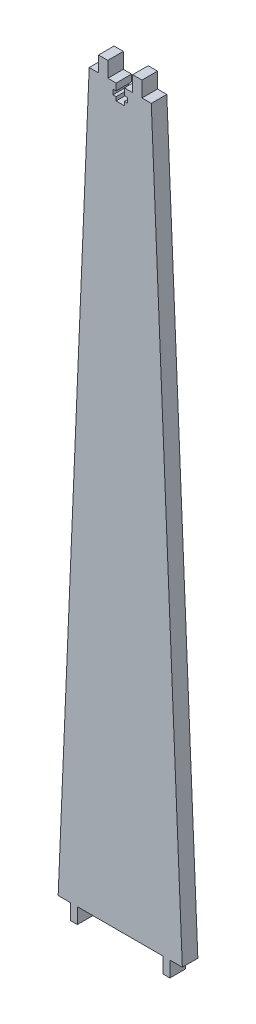
ISO-10303-21;
HEADER;
FILE_DESCRIPTION(('STEP AP214'),'2;1');
FILE_NAME('part.step','',(''),(''),'','','');
FILE_SCHEMA(('AUTOMOTIVE_DESIGN { 1 0 10303 214 1 1 1 1 }'));
ENDSEC;
DATA;
#1=APPLICATION_CONTEXT('core data for automotive mechanical design processes');
#2=APPLICATION_PROTOCOL_DEFINITION('international standard','automotive_design',2000,#1);
#3=PRODUCT_CONTEXT('',#1,'mechanical');
#4=PRODUCT('Part','Part','',(#3));
#5=PRODUCT_RELATED_PRODUCT_CATEGORY('part','',(#4));
#6=PRODUCT_DEFINITION_FORMATION('','',#4);
#7=PRODUCT_DEFINITION_CONTEXT('part definition',#1,'design');
#8=PRODUCT_DEFINITION('design','',#6,#7);
#9=PRODUCT_DEFINITION_SHAPE('','',#8);
#10=(LENGTH_UNIT() NAMED_UNIT(*) SI_UNIT(.MILLI.,.METRE.));
#11=(NAMED_UNIT(*) PLANE_ANGLE_UNIT() SI_UNIT($,.RADIAN.));
#12=(NAMED_UNIT(*) SI_UNIT($,.STERADIAN.) SOLID_ANGLE_UNIT());
#13=UNCERTAINTY_MEASURE_WITH_UNIT(LENGTH_MEASURE(1.E-05),#10,'distance_accuracy_value','');
#14=(GEOMETRIC_REPRESENTATION_CONTEXT(3) GLOBAL_UNCERTAINTY_ASSIGNED_CONTEXT((#13)) GLOBAL_UNIT_ASSIGNED_CONTEXT((#10,
#11,#12)) REPRESENTATION_CONTEXT('',''));
#15=CARTESIAN_POINT('',(0.,0.,0.));
#16=DIRECTION('',(0.,0.,1.));
#17=DIRECTION('',(1.,0.,0.));
#18=AXIS2_PLACEMENT_3D('',#15,#16,#17);
#19=CARTESIAN_POINT('',(-25.4,0.,6.35));
#20=DIRECTION('',(0.,1.,0.));
#21=DIRECTION('',(-1.,0.,0.));
#22=AXIS2_PLACEMENT_3D('',#19,#20,#21);
#23=PLANE('',#22);
#24=DIRECTION('',(1.,0.,0.));
#25=VECTOR('',#24,1.);
#26=CARTESIAN_POINT('',(-25.4,0.,0.));
#27=LINE('',#26,#25);
#28=CARTESIAN_POINT('',(-25.4,0.,0.));
#29=VERTEX_POINT('',#28);
#30=CARTESIAN_POINT('',(-20.3200000000001,0.,0.));
#31=VERTEX_POINT('',#30);
#32=EDGE_CURVE('E279',#29,#31,#27,.T.);
#33=ORIENTED_EDGE('',*,*,#32,.T.);
#34=DIRECTION('',(0.,0.,-1.));
#35=VECTOR('',#34,1.);
#36=CARTESIAN_POINT('',(-20.3200000000001,0.,6.35));
#37=LINE('',#36,#35);
#38=CARTESIAN_POINT('',(-20.3200000000001,0.,6.35));
#39=VERTEX_POINT('',#38);
#40=EDGE_CURVE('E11',#39,#31,#37,.T.);
#41=ORIENTED_EDGE('',*,*,#40,.F.);
#42=DIRECTION('',(1.,0.,0.));
#43=VECTOR('',#42,1.);
#44=CARTESIAN_POINT('',(-25.4,0.,6.35));
#45=LINE('',#44,#43);
#46=CARTESIAN_POINT('',(-25.4,0.,6.35));
#47=VERTEX_POINT('',#46);
#48=EDGE_CURVE('E341',#47,#39,#45,.T.);
#49=ORIENTED_EDGE('',*,*,#48,.F.);
#50=DIRECTION('',(0.,0.,-1.));
#51=VECTOR('',#50,1.);
#52=CARTESIAN_POINT('',(-25.4,0.,6.35));
#53=LINE('',#52,#51);
#54=EDGE_CURVE('E275',#47,#29,#53,.T.);
#55=ORIENTED_EDGE('',*,*,#54,.T.);
#56=EDGE_LOOP('',(#33,#41,#49,#55));
#57=FACE_BOUND('',#56,.T.);
#58=ADVANCED_FACE('F39',(#57),#23,.F.);
#59=CARTESIAN_POINT('',(-20.3200000000001,0.,6.35));
#60=DIRECTION('',(1.,0.,0.));
#61=DIRECTION('',(0.,1.,0.));
#62=AXIS2_PLACEMENT_3D('',#59,#60,#61);
#63=PLANE('',#62);
#64=DIRECTION('',(0.,-1.,0.));
#65=VECTOR('',#64,1.);
#66=CARTESIAN_POINT('',(-20.3200000000001,0.,0.));
#67=LINE('',#66,#65);
#68=CARTESIAN_POINT('',(-20.3200000000001,-6.35,0.));
#69=VERTEX_POINT('',#68);
#70=EDGE_CURVE('E282',#31,#69,#67,.T.);
#71=ORIENTED_EDGE('',*,*,#70,.T.);
#72=DIRECTION('',(0.,0.,-1.));
#73=VECTOR('',#72,1.);
#74=CARTESIAN_POINT('',(-20.3200000000001,-6.35,6.35));
#75=LINE('',#74,#73);
#76=CARTESIAN_POINT('',(-20.3200000000001,-6.35,6.35));
#77=VERTEX_POINT('',#76);
#78=EDGE_CURVE('E47',#77,#69,#75,.T.);
#79=ORIENTED_EDGE('',*,*,#78,.F.);
#80=DIRECTION('',(0.,-1.,0.));
#81=VECTOR('',#80,1.);
#82=CARTESIAN_POINT('',(-20.3200000000001,0.,6.35));
#83=LINE('',#82,#81);
#84=EDGE_CURVE('E170',#39,#77,#83,.T.);
#85=ORIENTED_EDGE('',*,*,#84,.F.);
#86=ORIENTED_EDGE('',*,*,#40,.T.);
#87=EDGE_LOOP('',(#71,#79,#85,#86));
#88=FACE_BOUND('',#87,.T.);
#89=ADVANCED_FACE('F519',(#88),#63,.F.);
#90=CARTESIAN_POINT('',(-20.3200000000001,-6.35,6.35));
#91=DIRECTION('',(0.,1.,0.));
#92=DIRECTION('',(0.,0.,1.));
#93=AXIS2_PLACEMENT_3D('',#90,#91,#92);
#94=PLANE('',#93);
#95=DIRECTION('',(1.,0.,0.));
#96=VECTOR('',#95,1.);
#97=CARTESIAN_POINT('',(-20.3200000000001,-6.35,0.));
#98=LINE('',#97,#96);
#99=CARTESIAN_POINT('',(-17.5260000000001,-6.35,0.));
#100=VERTEX_POINT('',#99);
#101=EDGE_CURVE('E284',#69,#100,#98,.T.);
#102=ORIENTED_EDGE('',*,*,#101,.T.);
#103=DIRECTION('',(0.,0.,-1.));
#104=VECTOR('',#103,1.);
#105=CARTESIAN_POINT('',(-17.5260000000001,-6.35,6.35));
#106=LINE('',#105,#104);
#107=CARTESIAN_POINT('',(-17.5260000000001,-6.35,6.35));
#108=VERTEX_POINT('',#107);
#109=EDGE_CURVE('E420',#108,#100,#106,.T.);
#110=ORIENTED_EDGE('',*,*,#109,.F.);
#111=DIRECTION('',(1.,0.,0.));
#112=VECTOR('',#111,1.);
#113=CARTESIAN_POINT('',(-20.3200000000001,-6.35,6.35));
#114=LINE('',#113,#112);
#115=EDGE_CURVE('E428',#77,#108,#114,.T.);
#116=ORIENTED_EDGE('',*,*,#115,.F.);
#117=ORIENTED_EDGE('',*,*,#78,.T.);
#118=EDGE_LOOP('',(#102,#110,#116,#117));
#119=FACE_BOUND('',#118,.T.);
#120=ADVANCED_FACE('F426',(#119),#94,.F.);
#121=CARTESIAN_POINT('',(-17.5260000000001,-6.35,6.35));
#122=DIRECTION('',(-1.,0.,0.));
#123=DIRECTION('',(0.,-1.,0.));
#124=AXIS2_PLACEMENT_3D('',#121,#122,#123);
#125=PLANE('',#124);
#126=DIRECTION('',(0.,1.,0.));
#127=VECTOR('',#126,1.);
#128=CARTESIAN_POINT('',(-17.5260000000001,-6.35,0.));
#129=LINE('',#128,#127);
#130=CARTESIAN_POINT('',(-17.526,0.,0.));
#131=VERTEX_POINT('',#130);
#132=EDGE_CURVE('E286',#100,#131,#129,.T.);
#133=ORIENTED_EDGE('',*,*,#132,.T.);
#134=DIRECTION('',(0.,0.,-1.));
#135=VECTOR('',#134,1.);
#136=CARTESIAN_POINT('',(-17.526,0.,6.35));
#137=LINE('',#136,#135);
#138=CARTESIAN_POINT('',(-17.526,0.,6.35));
#139=VERTEX_POINT('',#138);
#140=EDGE_CURVE('E417',#139,#131,#137,.T.);
#141=ORIENTED_EDGE('',*,*,#140,.F.);
#142=DIRECTION('',(0.,1.,0.));
#143=VECTOR('',#142,1.);
#144=CARTESIAN_POINT('',(-17.5260000000001,-6.35,6.35));
#145=LINE('',#144,#143);
#146=EDGE_CURVE('E446',#108,#139,#145,.T.);
#147=ORIENTED_EDGE('',*,*,#146,.F.);
#148=ORIENTED_EDGE('',*,*,#109,.T.);
#149=EDGE_LOOP('',(#133,#141,#147,#148));
#150=FACE_BOUND('',#149,.T.);
#151=ADVANCED_FACE('F437',(#150),#125,.F.);
#152=CARTESIAN_POINT('',(-17.526,0.,6.35));
#153=DIRECTION('',(0.,1.,0.));
#154=DIRECTION('',(0.,0.,1.));
#155=AXIS2_PLACEMENT_3D('',#152,#153,#154);
#156=PLANE('',#155);
#157=DIRECTION('',(1.,0.,0.));
#158=VECTOR('',#157,1.);
#159=CARTESIAN_POINT('',(-17.526,0.,0.));
#160=LINE('',#159,#158);
#161=CARTESIAN_POINT('',(17.526,0.,0.));
#162=VERTEX_POINT('',#161);
#163=EDGE_CURVE('E288',#131,#162,#160,.T.);
#164=ORIENTED_EDGE('',*,*,#163,.T.);
#165=DIRECTION('',(0.,0.,-1.));
#166=VECTOR('',#165,1.);
#167=CARTESIAN_POINT('',(17.526,0.,6.35));
#168=LINE('',#167,#166);
#169=CARTESIAN_POINT('',(17.526,0.,6.35));
#170=VERTEX_POINT('',#169);
#171=EDGE_CURVE('E414',#170,#162,#168,.T.);
#172=ORIENTED_EDGE('',*,*,#171,.F.);
#173=DIRECTION('',(1.,0.,0.));
#174=VECTOR('',#173,1.);
#175=CARTESIAN_POINT('',(-17.526,0.,6.35));
#176=LINE('',#175,#174);
#177=EDGE_CURVE('E443',#139,#170,#176,.T.);
#178=ORIENTED_EDGE('',*,*,#177,.F.);
#179=ORIENTED_EDGE('',*,*,#140,.T.);
#180=EDGE_LOOP('',(#164,#172,#178,#179));
#181=FACE_BOUND('',#180,.T.);
#182=ADVANCED_FACE('F441',(#181),#156,.F.);
#183=CARTESIAN_POINT('',(17.5260000000001,-6.35,6.35));
#184=DIRECTION('',(1.,0.,0.));
#185=DIRECTION('',(0.,1.,0.));
#186=AXIS2_PLACEMENT_3D('',#183,#184,#185);
#187=PLANE('',#186);
#188=DIRECTION('',(0.,-1.,0.));
#189=VECTOR('',#188,1.);
#190=CARTESIAN_POINT('',(17.5260000000001,-6.35,0.));
#191=LINE('',#190,#189);
#192=CARTESIAN_POINT('',(17.5260000000001,-6.35,0.));
#193=VERTEX_POINT('',#192);
#194=EDGE_CURVE('E290',#162,#193,#191,.T.);
#195=ORIENTED_EDGE('',*,*,#194,.T.);
#196=DIRECTION('',(0.,0.,-1.));
#197=VECTOR('',#196,1.);
#198=CARTESIAN_POINT('',(17.5260000000001,-6.35,6.35));
#199=LINE('',#198,#197);
#200=CARTESIAN_POINT('',(17.5260000000001,-6.35,6.35));
#201=VERTEX_POINT('',#200);
#202=EDGE_CURVE('E411',#201,#193,#199,.T.);
#203=ORIENTED_EDGE('',*,*,#202,.F.);
#204=DIRECTION('',(0.,-1.,0.));
#205=VECTOR('',#204,1.);
#206=CARTESIAN_POINT('',(17.5260000000001,-6.35,6.35));
#207=LINE('',#206,#205);
#208=EDGE_CURVE('E445',#170,#201,#207,.T.);
#209=ORIENTED_EDGE('',*,*,#208,.F.);
#210=ORIENTED_EDGE('',*,*,#171,.T.);
#211=EDGE_LOOP('',(#195,#203,#209,#210));
#212=FACE_BOUND('',#211,.T.);
#213=ADVANCED_FACE('F532',(#212),#187,.F.);
#214=CARTESIAN_POINT('',(20.3200000000001,-6.35,6.35));
#215=DIRECTION('',(0.,1.,0.));
#216=DIRECTION('',(0.,0.,1.));
#217=AXIS2_PLACEMENT_3D('',#214,#215,#216);
#218=PLANE('',#217);
#219=DIRECTION('',(1.,0.,0.));
#220=VECTOR('',#219,1.);
#221=CARTESIAN_POINT('',(20.3200000000001,-6.35,0.));
#222=LINE('',#221,#220);
#223=CARTESIAN_POINT('',(20.3200000000001,-6.35,0.));
#224=VERTEX_POINT('',#223);
#225=EDGE_CURVE('E292',#193,#224,#222,.T.);
#226=ORIENTED_EDGE('',*,*,#225,.T.);
#227=DIRECTION('',(0.,0.,-1.));
#228=VECTOR('',#227,1.);
#229=CARTESIAN_POINT('',(20.3200000000001,-6.35,6.35));
#230=LINE('',#229,#228);
#231=CARTESIAN_POINT('',(20.3200000000001,-6.35,6.35));
#232=VERTEX_POINT('',#231);
#233=EDGE_CURVE('E408',#232,#224,#230,.T.);
#234=ORIENTED_EDGE('',*,*,#233,.F.);
#235=DIRECTION('',(1.,0.,0.));
#236=VECTOR('',#235,1.);
#237=CARTESIAN_POINT('',(20.3200000000001,-6.35,6.35));
#238=LINE('',#237,#236);
#239=EDGE_CURVE('E448',#201,#232,#238,.T.);
#240=ORIENTED_EDGE('',*,*,#239,.F.);
#241=ORIENTED_EDGE('',*,*,#202,.T.);
#242=EDGE_LOOP('',(#226,#234,#240,#241));
#243=FACE_BOUND('',#242,.T.);
#244=ADVANCED_FACE('F535',(#243),#218,.F.);
#245=CARTESIAN_POINT('',(20.3200000000001,0.,6.35));
#246=DIRECTION('',(-1.,0.,0.));
#247=DIRECTION('',(0.,-1.,0.));
#248=AXIS2_PLACEMENT_3D('',#245,#246,#247);
#249=PLANE('',#248);
#250=DIRECTION('',(0.,1.,0.));
#251=VECTOR('',#250,1.);
#252=CARTESIAN_POINT('',(20.3200000000001,0.,0.));
#253=LINE('',#252,#251);
#254=CARTESIAN_POINT('',(20.3200000000001,0.,0.));
#255=VERTEX_POINT('',#254);
#256=EDGE_CURVE('E294',#224,#255,#253,.T.);
#257=ORIENTED_EDGE('',*,*,#256,.T.);
#258=DIRECTION('',(0.,0.,-1.));
#259=VECTOR('',#258,1.);
#260=CARTESIAN_POINT('',(20.3200000000001,0.,6.35));
#261=LINE('',#260,#259);
#262=CARTESIAN_POINT('',(20.3200000000001,0.,6.35));
#263=VERTEX_POINT('',#262);
#264=EDGE_CURVE('E405',#263,#255,#261,.T.);
#265=ORIENTED_EDGE('',*,*,#264,.F.);
#266=DIRECTION('',(0.,1.,0.));
#267=VECTOR('',#266,1.);
#268=CARTESIAN_POINT('',(20.3200000000001,0.,6.35));
#269=LINE('',#268,#267);
#270=EDGE_CURVE('E454',#232,#263,#269,.T.);
#271=ORIENTED_EDGE('',*,*,#270,.F.);
#272=ORIENTED_EDGE('',*,*,#233,.T.);
#273=EDGE_LOOP('',(#257,#265,#271,#272));
#274=FACE_BOUND('',#273,.T.);
#275=ADVANCED_FACE('F539',(#274),#249,.F.);
#276=CARTESIAN_POINT('',(25.4,0.,6.35));
#277=DIRECTION('',(0.,1.,0.));
#278=DIRECTION('',(-1.,0.,0.));
#279=AXIS2_PLACEMENT_3D('',#276,#277,#278);
#280=PLANE('',#279);
#281=DIRECTION('',(1.,0.,0.));
#282=VECTOR('',#281,1.);
#283=CARTESIAN_POINT('',(25.4,0.,0.));
#284=LINE('',#283,#282);
#285=CARTESIAN_POINT('',(25.4,0.,0.));
#286=VERTEX_POINT('',#285);
#287=EDGE_CURVE('E296',#255,#286,#284,.T.);
#288=ORIENTED_EDGE('',*,*,#287,.T.);
#289=DIRECTION('',(0.,0.,-1.));
#290=VECTOR('',#289,1.);
#291=CARTESIAN_POINT('',(25.4,0.,6.35));
#292=LINE('',#291,#290);
#293=CARTESIAN_POINT('',(25.4,0.,6.35));
#294=VERTEX_POINT('',#293);
#295=EDGE_CURVE('E402',#294,#286,#292,.T.);
#296=ORIENTED_EDGE('',*,*,#295,.F.);
#297=DIRECTION('',(1.,0.,0.));
#298=VECTOR('',#297,1.);
#299=CARTESIAN_POINT('',(25.4,0.,6.35));
#300=LINE('',#299,#298);
#301=EDGE_CURVE('E456',#263,#294,#300,.T.);
#302=ORIENTED_EDGE('',*,*,#301,.F.);
#303=ORIENTED_EDGE('',*,*,#264,.T.);
#304=EDGE_LOOP('',(#288,#296,#302,#303));
#305=FACE_BOUND('',#304,.T.);
#306=ADVANCED_FACE('F543',(#305),#280,.F.);
#307=CARTESIAN_POINT('',(25.4,0.,6.35));
#308=DIRECTION('',(-0.999103476537063,-0.0423348930736044,0.));
#309=DIRECTION('',(0.0423348930736044,-0.999103476537064,0.));
#310=AXIS2_PLACEMENT_3D('',#307,#308,#309);
#311=PLANE('',#310);
#312=DIRECTION('',(-0.0423348930736044,0.999103476537064,0.));
#313=VECTOR('',#312,1.);
#314=CARTESIAN_POINT('',(25.4,0.,0.));
#315=LINE('',#314,#313);
#316=CARTESIAN_POINT('',(12.7,299.72,0.));
#317=VERTEX_POINT('',#316);
#318=EDGE_CURVE('E298',#286,#317,#315,.T.);
#319=ORIENTED_EDGE('',*,*,#318,.T.);
#320=DIRECTION('',(0.,0.,-1.));
#321=VECTOR('',#320,1.);
#322=CARTESIAN_POINT('',(12.7,299.72,6.35));
#323=LINE('',#322,#321);
#324=CARTESIAN_POINT('',(12.7,299.72,6.35));
#325=VERTEX_POINT('',#324);
#326=EDGE_CURVE('E399',#325,#317,#323,.T.);
#327=ORIENTED_EDGE('',*,*,#326,.F.);
#328=DIRECTION('',(-0.0423348930736044,0.999103476537064,0.));
#329=VECTOR('',#328,1.);
#330=CARTESIAN_POINT('',(25.4,0.,6.35));
#331=LINE('',#330,#329);
#332=EDGE_CURVE('E458',#294,#325,#331,.T.);
#333=ORIENTED_EDGE('',*,*,#332,.F.);
#334=ORIENTED_EDGE('',*,*,#295,.T.);
#335=EDGE_LOOP('',(#319,#327,#333,#334));
#336=FACE_BOUND('',#335,.T.);
#337=ADVANCED_FACE('F547',(#336),#311,.F.);
#338=CARTESIAN_POINT('',(12.7,299.72,6.35));
#339=DIRECTION('',(0.,-1.,0.));
#340=DIRECTION('',(0.,0.,-1.));
#341=AXIS2_PLACEMENT_3D('',#338,#339,#340);
#342=PLANE('',#341);
#343=DIRECTION('',(-1.,0.,0.));
#344=VECTOR('',#343,1.);
#345=CARTESIAN_POINT('',(12.7,299.72,0.));
#346=LINE('',#345,#344);
#347=CARTESIAN_POINT('',(8.89,299.72,0.));
#348=VERTEX_POINT('',#347);
#349=EDGE_CURVE('E300',#317,#348,#346,.T.);
#350=ORIENTED_EDGE('',*,*,#349,.T.);
#351=DIRECTION('',(0.,0.,-1.));
#352=VECTOR('',#351,1.);
#353=CARTESIAN_POINT('',(8.89,299.72,6.35));
#354=LINE('',#353,#352);
#355=CARTESIAN_POINT('',(8.89,299.72,6.35));
#356=VERTEX_POINT('',#355);
#357=EDGE_CURVE('E396',#356,#348,#354,.T.);
#358=ORIENTED_EDGE('',*,*,#357,.F.);
#359=DIRECTION('',(-1.,0.,0.));
#360=VECTOR('',#359,1.);
#361=CARTESIAN_POINT('',(12.7,299.72,6.35));
#362=LINE('',#361,#360);
#363=EDGE_CURVE('E460',#325,#356,#362,.T.);
#364=ORIENTED_EDGE('',*,*,#363,.F.);
#365=ORIENTED_EDGE('',*,*,#326,.T.);
#366=EDGE_LOOP('',(#350,#358,#364,#365));
#367=FACE_BOUND('',#366,.T.);
#368=ADVANCED_FACE('F551',(#367),#342,.F.);
#369=CARTESIAN_POINT('',(8.89,306.07,6.35));
#370=DIRECTION('',(-1.,0.,0.));
#371=DIRECTION('',(0.,-1.,0.));
#372=AXIS2_PLACEMENT_3D('',#369,#370,#371);
#373=PLANE('',#372);
#374=DIRECTION('',(0.,1.,0.));
#375=VECTOR('',#374,1.);
#376=CARTESIAN_POINT('',(8.89,306.07,0.));
#377=LINE('',#376,#375);
#378=CARTESIAN_POINT('',(8.89,306.07,0.));
#379=VERTEX_POINT('',#378);
#380=EDGE_CURVE('E302',#348,#379,#377,.T.);
#381=ORIENTED_EDGE('',*,*,#380,.T.);
#382=DIRECTION('',(0.,0.,-1.));
#383=VECTOR('',#382,1.);
#384=CARTESIAN_POINT('',(8.89,306.07,6.35));
#385=LINE('',#384,#383);
#386=CARTESIAN_POINT('',(8.89,306.07,6.35));
#387=VERTEX_POINT('',#386);
#388=EDGE_CURVE('E393',#387,#379,#385,.T.);
#389=ORIENTED_EDGE('',*,*,#388,.F.);
#390=DIRECTION('',(0.,1.,0.));
#391=VECTOR('',#390,1.);
#392=CARTESIAN_POINT('',(8.89,306.07,6.35));
#393=LINE('',#392,#391);
#394=EDGE_CURVE('E462',#356,#387,#393,.T.);
#395=ORIENTED_EDGE('',*,*,#394,.F.);
#396=ORIENTED_EDGE('',*,*,#357,.T.);
#397=EDGE_LOOP('',(#381,#389,#395,#396));
#398=FACE_BOUND('',#397,.T.);
#399=ADVANCED_FACE('F555',(#398),#373,.F.);
#400=CARTESIAN_POINT('',(8.89,306.07,6.35));
#401=DIRECTION('',(0.,-1.,0.));
#402=DIRECTION('',(0.,0.,-1.));
#403=AXIS2_PLACEMENT_3D('',#400,#401,#402);
#404=PLANE('',#403);
#405=DIRECTION('',(-1.,0.,0.));
#406=VECTOR('',#405,1.);
#407=CARTESIAN_POINT('',(8.89,306.07,0.));
#408=LINE('',#407,#406);
#409=CARTESIAN_POINT('',(5.08,306.07,0.));
#410=VERTEX_POINT('',#409);
#411=EDGE_CURVE('E304',#379,#410,#408,.T.);
#412=ORIENTED_EDGE('',*,*,#411,.T.);
#413=DIRECTION('',(0.,0.,-1.));
#414=VECTOR('',#413,1.);
#415=CARTESIAN_POINT('',(5.08,306.07,6.35));
#416=LINE('',#415,#414);
#417=CARTESIAN_POINT('',(5.08,306.07,6.35));
#418=VERTEX_POINT('',#417);
#419=EDGE_CURVE('E390',#418,#410,#416,.T.);
#420=ORIENTED_EDGE('',*,*,#419,.F.);
#421=DIRECTION('',(-1.,0.,0.));
#422=VECTOR('',#421,1.);
#423=CARTESIAN_POINT('',(8.89,306.07,6.35));
#424=LINE('',#423,#422);
#425=EDGE_CURVE('E464',#387,#418,#424,.T.);
#426=ORIENTED_EDGE('',*,*,#425,.F.);
#427=ORIENTED_EDGE('',*,*,#388,.T.);
#428=EDGE_LOOP('',(#412,#420,#426,#427));
#429=FACE_BOUND('',#428,.T.);
#430=ADVANCED_FACE('F559',(#429),#404,.F.);
#431=CARTESIAN_POINT('',(5.08,306.07,6.35));
#432=DIRECTION('',(1.,0.,0.));
#433=DIRECTION('',(0.,1.,0.));
#434=AXIS2_PLACEMENT_3D('',#431,#432,#433);
#435=PLANE('',#434);
#436=DIRECTION('',(0.,-1.,0.));
#437=VECTOR('',#436,1.);
#438=CARTESIAN_POINT('',(5.08,306.07,0.));
#439=LINE('',#438,#437);
#440=CARTESIAN_POINT('',(5.08,299.72,0.));
#441=VERTEX_POINT('',#440);
#442=EDGE_CURVE('E306',#410,#441,#439,.T.);
#443=ORIENTED_EDGE('',*,*,#442,.T.);
#444=DIRECTION('',(0.,0.,-1.));
#445=VECTOR('',#444,1.);
#446=CARTESIAN_POINT('',(5.08,299.72,6.35));
#447=LINE('',#446,#445);
#448=CARTESIAN_POINT('',(5.08,299.72,6.35));
#449=VERTEX_POINT('',#448);
#450=EDGE_CURVE('E387',#449,#441,#447,.T.);
#451=ORIENTED_EDGE('',*,*,#450,.F.);
#452=DIRECTION('',(0.,-1.,0.));
#453=VECTOR('',#452,1.);
#454=CARTESIAN_POINT('',(5.08,306.07,6.35));
#455=LINE('',#454,#453);
#456=EDGE_CURVE('E466',#418,#449,#455,.T.);
#457=ORIENTED_EDGE('',*,*,#456,.F.);
#458=ORIENTED_EDGE('',*,*,#419,.T.);
#459=EDGE_LOOP('',(#443,#451,#457,#458));
#460=FACE_BOUND('',#459,.T.);
#461=ADVANCED_FACE('F563',(#460),#435,.F.);
#462=CARTESIAN_POINT('',(5.08,299.72,6.35));
#463=DIRECTION('',(0.,-1.,0.));
#464=DIRECTION('',(0.,0.,-1.));
#465=AXIS2_PLACEMENT_3D('',#462,#463,#464);
#466=PLANE('',#465);
#467=DIRECTION('',(-1.,0.,0.));
#468=VECTOR('',#467,1.);
#469=CARTESIAN_POINT('',(5.08,299.72,0.));
#470=LINE('',#469,#468);
#471=CARTESIAN_POINT('',(1.7,299.72,0.));
#472=VERTEX_POINT('',#471);
#473=EDGE_CURVE('E308',#441,#472,#470,.T.);
#474=ORIENTED_EDGE('',*,*,#473,.T.);
#475=DIRECTION('',(0.,0.,-1.));
#476=VECTOR('',#475,1.);
#477=CARTESIAN_POINT('',(1.7,299.72,6.35));
#478=LINE('',#477,#476);
#479=CARTESIAN_POINT('',(1.7,299.72,6.35));
#480=VERTEX_POINT('',#479);
#481=EDGE_CURVE('E384',#480,#472,#478,.T.);
#482=ORIENTED_EDGE('',*,*,#481,.F.);
#483=DIRECTION('',(-1.,0.,0.));
#484=VECTOR('',#483,1.);
#485=CARTESIAN_POINT('',(5.08,299.72,6.35));
#486=LINE('',#485,#484);
#487=EDGE_CURVE('E468',#449,#480,#486,.T.);
#488=ORIENTED_EDGE('',*,*,#487,.F.);
#489=ORIENTED_EDGE('',*,*,#450,.T.);
#490=EDGE_LOOP('',(#474,#482,#488,#489));
#491=FACE_BOUND('',#490,.T.);
#492=ADVANCED_FACE('F567',(#491),#466,.F.);
#493=CARTESIAN_POINT('',(1.7,299.72,6.35));
#494=DIRECTION('',(1.,0.,0.));
#495=DIRECTION('',(0.,1.,0.));
#496=AXIS2_PLACEMENT_3D('',#493,#494,#495);
#497=PLANE('',#496);
#498=DIRECTION('',(0.,-1.,0.));
#499=VECTOR('',#498,1.);
#500=CARTESIAN_POINT('',(1.7,299.72,0.));
#501=LINE('',#500,#499);
#502=CARTESIAN_POINT('',(1.7,296.926,0.));
#503=VERTEX_POINT('',#502);
#504=EDGE_CURVE('E310',#472,#503,#501,.T.);
#505=ORIENTED_EDGE('',*,*,#504,.T.);
#506=DIRECTION('',(0.,0.,-1.));
#507=VECTOR('',#506,1.);
#508=CARTESIAN_POINT('',(1.7,296.926,6.35));
#509=LINE('',#508,#507);
#510=CARTESIAN_POINT('',(1.7,296.926,6.35));
#511=VERTEX_POINT('',#510);
#512=EDGE_CURVE('E381',#511,#503,#509,.T.);
#513=ORIENTED_EDGE('',*,*,#512,.F.);
#514=DIRECTION('',(0.,-1.,0.));
#515=VECTOR('',#514,1.);
#516=CARTESIAN_POINT('',(1.7,299.72,6.35));
#517=LINE('',#516,#515);
#518=EDGE_CURVE('E470',#480,#511,#517,.T.);
#519=ORIENTED_EDGE('',*,*,#518,.F.);
#520=ORIENTED_EDGE('',*,*,#481,.T.);
#521=EDGE_LOOP('',(#505,#513,#519,#520));
#522=FACE_BOUND('',#521,.T.);
#523=ADVANCED_FACE('F571',(#522),#497,.F.);
#524=CARTESIAN_POINT('',(1.7,296.926,6.35));
#525=DIRECTION('',(0.,1.,0.));
#526=DIRECTION('',(0.,0.,1.));
#527=AXIS2_PLACEMENT_3D('',#524,#525,#526);
#528=PLANE('',#527);
#529=DIRECTION('',(1.,0.,0.));
#530=VECTOR('',#529,1.);
#531=CARTESIAN_POINT('',(1.7,296.926,0.));
#532=LINE('',#531,#530);
#533=CARTESIAN_POINT('',(2.97,296.926,0.));
#534=VERTEX_POINT('',#533);
#535=EDGE_CURVE('E312',#503,#534,#532,.T.);
#536=ORIENTED_EDGE('',*,*,#535,.T.);
#537=DIRECTION('',(0.,0.,-1.));
#538=VECTOR('',#537,1.);
#539=CARTESIAN_POINT('',(2.97,296.926,6.35));
#540=LINE('',#539,#538);
#541=CARTESIAN_POINT('',(2.97,296.926,6.35));
#542=VERTEX_POINT('',#541);
#543=EDGE_CURVE('E378',#542,#534,#540,.T.);
#544=ORIENTED_EDGE('',*,*,#543,.F.);
#545=DIRECTION('',(1.,0.,0.));
#546=VECTOR('',#545,1.);
#547=CARTESIAN_POINT('',(1.7,296.926,6.35));
#548=LINE('',#547,#546);
#549=EDGE_CURVE('E472',#511,#542,#548,.T.);
#550=ORIENTED_EDGE('',*,*,#549,.F.);
#551=ORIENTED_EDGE('',*,*,#512,.T.);
#552=EDGE_LOOP('',(#536,#544,#550,#551));
#553=FACE_BOUND('',#552,.T.);
#554=ADVANCED_FACE('F575',(#553),#528,.F.);
#555=CARTESIAN_POINT('',(2.97,296.926,6.35));
#556=DIRECTION('',(1.,0.,0.));
#557=DIRECTION('',(0.,1.,0.));
#558=AXIS2_PLACEMENT_3D('',#555,#556,#557);
#559=PLANE('',#558);
#560=DIRECTION('',(0.,-1.,0.));
#561=VECTOR('',#560,1.);
#562=CARTESIAN_POINT('',(2.97,296.926,0.));
#563=LINE('',#562,#561);
#564=CARTESIAN_POINT('',(2.97,294.894,0.));
#565=VERTEX_POINT('',#564);
#566=EDGE_CURVE('E314',#534,#565,#563,.T.);
#567=ORIENTED_EDGE('',*,*,#566,.T.);
#568=DIRECTION('',(0.,0.,-1.));
#569=VECTOR('',#568,1.);
#570=CARTESIAN_POINT('',(2.97,294.894,6.35));
#571=LINE('',#570,#569);
#572=CARTESIAN_POINT('',(2.97,294.894,6.35));
#573=VERTEX_POINT('',#572);
#574=EDGE_CURVE('E375',#573,#565,#571,.T.);
#575=ORIENTED_EDGE('',*,*,#574,.F.);
#576=DIRECTION('',(0.,-1.,0.));
#577=VECTOR('',#576,1.);
#578=CARTESIAN_POINT('',(2.97,296.926,6.35));
#579=LINE('',#578,#577);
#580=EDGE_CURVE('E474',#542,#573,#579,.T.);
#581=ORIENTED_EDGE('',*,*,#580,.F.);
#582=ORIENTED_EDGE('',*,*,#543,.T.);
#583=EDGE_LOOP('',(#567,#575,#581,#582));
#584=FACE_BOUND('',#583,.T.);
#585=ADVANCED_FACE('F579',(#584),#559,.F.);
#586=CARTESIAN_POINT('',(2.97,294.894,6.35));
#587=DIRECTION('',(0.,-1.,0.));
#588=DIRECTION('',(0.,0.,-1.));
#589=AXIS2_PLACEMENT_3D('',#586,#587,#588);
#590=PLANE('',#589);
#591=DIRECTION('',(-1.,0.,0.));
#592=VECTOR('',#591,1.);
#593=CARTESIAN_POINT('',(2.97,294.894,0.));
#594=LINE('',#593,#592);
#595=CARTESIAN_POINT('',(1.7,294.894,0.));
#596=VERTEX_POINT('',#595);
#597=EDGE_CURVE('E316',#565,#596,#594,.T.);
#598=ORIENTED_EDGE('',*,*,#597,.T.);
#599=DIRECTION('',(0.,0.,-1.));
#600=VECTOR('',#599,1.);
#601=CARTESIAN_POINT('',(1.7,294.894,6.35));
#602=LINE('',#601,#600);
#603=CARTESIAN_POINT('',(1.7,294.894,6.35));
#604=VERTEX_POINT('',#603);
#605=EDGE_CURVE('E372',#604,#596,#602,.T.);
#606=ORIENTED_EDGE('',*,*,#605,.F.);
#607=DIRECTION('',(-1.,0.,0.));
#608=VECTOR('',#607,1.);
#609=CARTESIAN_POINT('',(2.97,294.894,6.35));
#610=LINE('',#609,#608);
#611=EDGE_CURVE('E476',#573,#604,#610,.T.);
#612=ORIENTED_EDGE('',*,*,#611,.F.);
#613=ORIENTED_EDGE('',*,*,#574,.T.);
#614=EDGE_LOOP('',(#598,#606,#612,#613));
#615=FACE_BOUND('',#614,.T.);
#616=ADVANCED_FACE('F583',(#615),#590,.F.);
#617=CARTESIAN_POINT('',(1.7,294.894,6.35));
#618=DIRECTION('',(1.,0.,0.));
#619=DIRECTION('',(0.,1.,0.));
#620=AXIS2_PLACEMENT_3D('',#617,#618,#619);
#621=PLANE('',#620);
#622=DIRECTION('',(0.,-1.,0.));
#623=VECTOR('',#622,1.);
#624=CARTESIAN_POINT('',(1.7,294.894,0.));
#625=LINE('',#624,#623);
#626=CARTESIAN_POINT('',(1.7,293.37,0.));
#627=VERTEX_POINT('',#626);
#628=EDGE_CURVE('E318',#596,#627,#625,.T.);
#629=ORIENTED_EDGE('',*,*,#628,.T.);
#630=DIRECTION('',(0.,0.,-1.));
#631=VECTOR('',#630,1.);
#632=CARTESIAN_POINT('',(1.7,293.37,6.35));
#633=LINE('',#632,#631);
#634=CARTESIAN_POINT('',(1.7,293.37,6.35));
#635=VERTEX_POINT('',#634);
#636=EDGE_CURVE('E369',#635,#627,#633,.T.);
#637=ORIENTED_EDGE('',*,*,#636,.F.);
#638=DIRECTION('',(0.,-1.,0.));
#639=VECTOR('',#638,1.);
#640=CARTESIAN_POINT('',(1.7,294.894,6.35));
#641=LINE('',#640,#639);
#642=EDGE_CURVE('E478',#604,#635,#641,.T.);
#643=ORIENTED_EDGE('',*,*,#642,.F.);
#644=ORIENTED_EDGE('',*,*,#605,.T.);
#645=EDGE_LOOP('',(#629,#637,#643,#644));
#646=FACE_BOUND('',#645,.T.);
#647=ADVANCED_FACE('F587',(#646),#621,.F.);
#648=CARTESIAN_POINT('',(1.7,293.37,6.35));
#649=DIRECTION('',(0.,-1.,0.));
#650=DIRECTION('',(0.,0.,-1.));
#651=AXIS2_PLACEMENT_3D('',#648,#649,#650);
#652=PLANE('',#651);
#653=DIRECTION('',(-1.,0.,0.));
#654=VECTOR('',#653,1.);
#655=CARTESIAN_POINT('',(1.7,293.37,0.));
#656=LINE('',#655,#654);
#657=CARTESIAN_POINT('',(-1.7,293.37,0.));
#658=VERTEX_POINT('',#657);
#659=EDGE_CURVE('E320',#627,#658,#656,.T.);
#660=ORIENTED_EDGE('',*,*,#659,.T.);
#661=DIRECTION('',(0.,0.,-1.));
#662=VECTOR('',#661,1.);
#663=CARTESIAN_POINT('',(-1.7,293.37,6.35));
#664=LINE('',#663,#662);
#665=CARTESIAN_POINT('',(-1.7,293.37,6.35));
#666=VERTEX_POINT('',#665);
#667=EDGE_CURVE('E366',#666,#658,#664,.T.);
#668=ORIENTED_EDGE('',*,*,#667,.F.);
#669=DIRECTION('',(-1.,0.,0.));
#670=VECTOR('',#669,1.);
#671=CARTESIAN_POINT('',(1.7,293.37,6.35));
#672=LINE('',#671,#670);
#673=EDGE_CURVE('E480',#635,#666,#672,.T.);
#674=ORIENTED_EDGE('',*,*,#673,.F.);
#675=ORIENTED_EDGE('',*,*,#636,.T.);
#676=EDGE_LOOP('',(#660,#668,#674,#675));
#677=FACE_BOUND('',#676,.T.);
#678=ADVANCED_FACE('F591',(#677),#652,.F.);
#679=CARTESIAN_POINT('',(-1.7,294.894,6.35));
#680=DIRECTION('',(-1.,0.,0.));
#681=DIRECTION('',(0.,-1.,0.));
#682=AXIS2_PLACEMENT_3D('',#679,#680,#681);
#683=PLANE('',#682);
#684=DIRECTION('',(0.,1.,0.));
#685=VECTOR('',#684,1.);
#686=CARTESIAN_POINT('',(-1.7,294.894,0.));
#687=LINE('',#686,#685);
#688=CARTESIAN_POINT('',(-1.7,294.894,0.));
#689=VERTEX_POINT('',#688);
#690=EDGE_CURVE('E322',#658,#689,#687,.T.);
#691=ORIENTED_EDGE('',*,*,#690,.T.);
#692=DIRECTION('',(0.,0.,-1.));
#693=VECTOR('',#692,1.);
#694=CARTESIAN_POINT('',(-1.7,294.894,6.35));
#695=LINE('',#694,#693);
#696=CARTESIAN_POINT('',(-1.7,294.894,6.35));
#697=VERTEX_POINT('',#696);
#698=EDGE_CURVE('E363',#697,#689,#695,.T.);
#699=ORIENTED_EDGE('',*,*,#698,.F.);
#700=DIRECTION('',(0.,1.,0.));
#701=VECTOR('',#700,1.);
#702=CARTESIAN_POINT('',(-1.7,294.894,6.35));
#703=LINE('',#702,#701);
#704=EDGE_CURVE('E482',#666,#697,#703,.T.);
#705=ORIENTED_EDGE('',*,*,#704,.F.);
#706=ORIENTED_EDGE('',*,*,#667,.T.);
#707=EDGE_LOOP('',(#691,#699,#705,#706));
#708=FACE_BOUND('',#707,.T.);
#709=ADVANCED_FACE('F595',(#708),#683,.F.);
#710=CARTESIAN_POINT('',(-2.97,294.894,6.35));
#711=DIRECTION('',(0.,-1.,0.));
#712=DIRECTION('',(0.,0.,-1.));
#713=AXIS2_PLACEMENT_3D('',#710,#711,#712);
#714=PLANE('',#713);
#715=DIRECTION('',(-1.,0.,0.));
#716=VECTOR('',#715,1.);
#717=CARTESIAN_POINT('',(-2.97,294.894,0.));
#718=LINE('',#717,#716);
#719=CARTESIAN_POINT('',(-2.97,294.894,0.));
#720=VERTEX_POINT('',#719);
#721=EDGE_CURVE('E324',#689,#720,#718,.T.);
#722=ORIENTED_EDGE('',*,*,#721,.T.);
#723=DIRECTION('',(0.,0.,-1.));
#724=VECTOR('',#723,1.);
#725=CARTESIAN_POINT('',(-2.97,294.894,6.35));
#726=LINE('',#725,#724);
#727=CARTESIAN_POINT('',(-2.97,294.894,6.35));
#728=VERTEX_POINT('',#727);
#729=EDGE_CURVE('E360',#728,#720,#726,.T.);
#730=ORIENTED_EDGE('',*,*,#729,.F.);
#731=DIRECTION('',(-1.,0.,0.));
#732=VECTOR('',#731,1.);
#733=CARTESIAN_POINT('',(-2.97,294.894,6.35));
#734=LINE('',#733,#732);
#735=EDGE_CURVE('E484',#697,#728,#734,.T.);
#736=ORIENTED_EDGE('',*,*,#735,.F.);
#737=ORIENTED_EDGE('',*,*,#698,.T.);
#738=EDGE_LOOP('',(#722,#730,#736,#737));
#739=FACE_BOUND('',#738,.T.);
#740=ADVANCED_FACE('F599',(#739),#714,.F.);
#741=CARTESIAN_POINT('',(-2.97,296.926,6.35));
#742=DIRECTION('',(-1.,0.,0.));
#743=DIRECTION('',(0.,-1.,0.));
#744=AXIS2_PLACEMENT_3D('',#741,#742,#743);
#745=PLANE('',#744);
#746=DIRECTION('',(0.,1.,0.));
#747=VECTOR('',#746,1.);
#748=CARTESIAN_POINT('',(-2.97,296.926,0.));
#749=LINE('',#748,#747);
#750=CARTESIAN_POINT('',(-2.97,296.926,0.));
#751=VERTEX_POINT('',#750);
#752=EDGE_CURVE('E326',#720,#751,#749,.T.);
#753=ORIENTED_EDGE('',*,*,#752,.T.);
#754=DIRECTION('',(0.,0.,-1.));
#755=VECTOR('',#754,1.);
#756=CARTESIAN_POINT('',(-2.97,296.926,6.35));
#757=LINE('',#756,#755);
#758=CARTESIAN_POINT('',(-2.97,296.926,6.35));
#759=VERTEX_POINT('',#758);
#760=EDGE_CURVE('E357',#759,#751,#757,.T.);
#761=ORIENTED_EDGE('',*,*,#760,.F.);
#762=DIRECTION('',(0.,1.,0.));
#763=VECTOR('',#762,1.);
#764=CARTESIAN_POINT('',(-2.97,296.926,6.35));
#765=LINE('',#764,#763);
#766=EDGE_CURVE('E486',#728,#759,#765,.T.);
#767=ORIENTED_EDGE('',*,*,#766,.F.);
#768=ORIENTED_EDGE('',*,*,#729,.T.);
#769=EDGE_LOOP('',(#753,#761,#767,#768));
#770=FACE_BOUND('',#769,.T.);
#771=ADVANCED_FACE('F603',(#770),#745,.F.);
#772=CARTESIAN_POINT('',(-1.7,296.926,6.35));
#773=DIRECTION('',(0.,1.,0.));
#774=DIRECTION('',(0.,0.,1.));
#775=AXIS2_PLACEMENT_3D('',#772,#773,#774);
#776=PLANE('',#775);
#777=DIRECTION('',(1.,0.,0.));
#778=VECTOR('',#777,1.);
#779=CARTESIAN_POINT('',(-1.7,296.926,0.));
#780=LINE('',#779,#778);
#781=CARTESIAN_POINT('',(-1.7,296.926,0.));
#782=VERTEX_POINT('',#781);
#783=EDGE_CURVE('E328',#751,#782,#780,.T.);
#784=ORIENTED_EDGE('',*,*,#783,.T.);
#785=DIRECTION('',(0.,0.,-1.));
#786=VECTOR('',#785,1.);
#787=CARTESIAN_POINT('',(-1.7,296.926,6.35));
#788=LINE('',#787,#786);
#789=CARTESIAN_POINT('',(-1.7,296.926,6.35));
#790=VERTEX_POINT('',#789);
#791=EDGE_CURVE('E354',#790,#782,#788,.T.);
#792=ORIENTED_EDGE('',*,*,#791,.F.);
#793=DIRECTION('',(1.,0.,0.));
#794=VECTOR('',#793,1.);
#795=CARTESIAN_POINT('',(-1.7,296.926,6.35));
#796=LINE('',#795,#794);
#797=EDGE_CURVE('E488',#759,#790,#796,.T.);
#798=ORIENTED_EDGE('',*,*,#797,.F.);
#799=ORIENTED_EDGE('',*,*,#760,.T.);
#800=EDGE_LOOP('',(#784,#792,#798,#799));
#801=FACE_BOUND('',#800,.T.);
#802=ADVANCED_FACE('F607',(#801),#776,.F.);
#803=CARTESIAN_POINT('',(-1.7,299.72,6.35));
#804=DIRECTION('',(-1.,0.,0.));
#805=DIRECTION('',(0.,-1.,0.));
#806=AXIS2_PLACEMENT_3D('',#803,#804,#805);
#807=PLANE('',#806);
#808=DIRECTION('',(0.,1.,0.));
#809=VECTOR('',#808,1.);
#810=CARTESIAN_POINT('',(-1.7,299.72,0.));
#811=LINE('',#810,#809);
#812=CARTESIAN_POINT('',(-1.7,299.72,0.));
#813=VERTEX_POINT('',#812);
#814=EDGE_CURVE('E330',#782,#813,#811,.T.);
#815=ORIENTED_EDGE('',*,*,#814,.T.);
#816=DIRECTION('',(0.,0.,-1.));
#817=VECTOR('',#816,1.);
#818=CARTESIAN_POINT('',(-1.7,299.72,6.35));
#819=LINE('',#818,#817);
#820=CARTESIAN_POINT('',(-1.7,299.72,6.35));
#821=VERTEX_POINT('',#820);
#822=EDGE_CURVE('E351',#821,#813,#819,.T.);
#823=ORIENTED_EDGE('',*,*,#822,.F.);
#824=DIRECTION('',(0.,1.,0.));
#825=VECTOR('',#824,1.);
#826=CARTESIAN_POINT('',(-1.7,299.72,6.35));
#827=LINE('',#826,#825);
#828=EDGE_CURVE('E490',#790,#821,#827,.T.);
#829=ORIENTED_EDGE('',*,*,#828,.F.);
#830=ORIENTED_EDGE('',*,*,#791,.T.);
#831=EDGE_LOOP('',(#815,#823,#829,#830));
#832=FACE_BOUND('',#831,.T.);
#833=ADVANCED_FACE('F611',(#832),#807,.F.);
#834=CARTESIAN_POINT('',(-5.08,299.72,6.35));
#835=DIRECTION('',(0.,-1.,0.));
#836=DIRECTION('',(0.,0.,-1.));
#837=AXIS2_PLACEMENT_3D('',#834,#835,#836);
#838=PLANE('',#837);
#839=DIRECTION('',(-1.,0.,0.));
#840=VECTOR('',#839,1.);
#841=CARTESIAN_POINT('',(-5.08,299.72,0.));
#842=LINE('',#841,#840);
#843=CARTESIAN_POINT('',(-5.08,299.72,0.));
#844=VERTEX_POINT('',#843);
#845=EDGE_CURVE('E332',#813,#844,#842,.T.);
#846=ORIENTED_EDGE('',*,*,#845,.T.);
#847=DIRECTION('',(0.,0.,-1.));
#848=VECTOR('',#847,1.);
#849=CARTESIAN_POINT('',(-5.08,299.72,6.35));
#850=LINE('',#849,#848);
#851=CARTESIAN_POINT('',(-5.08,299.72,6.35));
#852=VERTEX_POINT('',#851);
#853=EDGE_CURVE('E348',#852,#844,#850,.T.);
#854=ORIENTED_EDGE('',*,*,#853,.F.);
#855=DIRECTION('',(-1.,0.,0.));
#856=VECTOR('',#855,1.);
#857=CARTESIAN_POINT('',(-5.08,299.72,6.35));
#858=LINE('',#857,#856);
#859=EDGE_CURVE('E492',#821,#852,#858,.T.);
#860=ORIENTED_EDGE('',*,*,#859,.F.);
#861=ORIENTED_EDGE('',*,*,#822,.T.);
#862=EDGE_LOOP('',(#846,#854,#860,#861));
#863=FACE_BOUND('',#862,.T.);
#864=ADVANCED_FACE('F615',(#863),#838,.F.);
#865=CARTESIAN_POINT('',(-5.08,306.07,6.35));
#866=DIRECTION('',(-1.,0.,0.));
#867=DIRECTION('',(0.,-1.,0.));
#868=AXIS2_PLACEMENT_3D('',#865,#866,#867);
#869=PLANE('',#868);
#870=DIRECTION('',(0.,1.,0.));
#871=VECTOR('',#870,1.);
#872=CARTESIAN_POINT('',(-5.08,306.07,0.));
#873=LINE('',#872,#871);
#874=CARTESIAN_POINT('',(-5.08,306.07,0.));
#875=VERTEX_POINT('',#874);
#876=EDGE_CURVE('E334',#844,#875,#873,.T.);
#877=ORIENTED_EDGE('',*,*,#876,.T.);
#878=DIRECTION('',(0.,0.,-1.));
#879=VECTOR('',#878,1.);
#880=CARTESIAN_POINT('',(-5.08,306.07,6.35));
#881=LINE('',#880,#879);
#882=CARTESIAN_POINT('',(-5.08,306.07,6.35));
#883=VERTEX_POINT('',#882);
#884=EDGE_CURVE('E345',#883,#875,#881,.T.);
#885=ORIENTED_EDGE('',*,*,#884,.F.);
#886=DIRECTION('',(0.,1.,0.));
#887=VECTOR('',#886,1.);
#888=CARTESIAN_POINT('',(-5.08,306.07,6.35));
#889=LINE('',#888,#887);
#890=EDGE_CURVE('E494',#852,#883,#889,.T.);
#891=ORIENTED_EDGE('',*,*,#890,.F.);
#892=ORIENTED_EDGE('',*,*,#853,.T.);
#893=EDGE_LOOP('',(#877,#885,#891,#892));
#894=FACE_BOUND('',#893,.T.);
#895=ADVANCED_FACE('F500',(#894),#869,.F.);
#896=CARTESIAN_POINT('',(-8.89,306.07,6.35));
#897=DIRECTION('',(0.,-1.,0.));
#898=DIRECTION('',(0.,0.,-1.));
#899=AXIS2_PLACEMENT_3D('',#896,#897,#898);
#900=PLANE('',#899);
#901=DIRECTION('',(-1.,0.,0.));
#902=VECTOR('',#901,1.);
#903=CARTESIAN_POINT('',(-8.89,306.07,0.));
#904=LINE('',#903,#902);
#905=CARTESIAN_POINT('',(-8.89,306.07,0.));
#906=VERTEX_POINT('',#905);
#907=EDGE_CURVE('E336',#875,#906,#904,.T.);
#908=ORIENTED_EDGE('',*,*,#907,.T.);
#909=DIRECTION('',(0.,0.,-1.));
#910=VECTOR('',#909,1.);
#911=CARTESIAN_POINT('',(-8.89,306.07,6.35));
#912=LINE('',#911,#910);
#913=CARTESIAN_POINT('',(-8.89,306.07,6.35));
#914=VERTEX_POINT('',#913);
#915=EDGE_CURVE('E270',#914,#906,#912,.T.);
#916=ORIENTED_EDGE('',*,*,#915,.F.);
#917=DIRECTION('',(-1.,0.,0.));
#918=VECTOR('',#917,1.);
#919=CARTESIAN_POINT('',(-8.89,306.07,6.35));
#920=LINE('',#919,#918);
#921=EDGE_CURVE('E261',#883,#914,#920,.T.);
#922=ORIENTED_EDGE('',*,*,#921,.F.);
#923=ORIENTED_EDGE('',*,*,#884,.T.);
#924=EDGE_LOOP('',(#908,#916,#922,#923));
#925=FACE_BOUND('',#924,.T.);
#926=ADVANCED_FACE('F504',(#925),#900,.F.);
#927=CARTESIAN_POINT('',(-8.89,306.07,6.35));
#928=DIRECTION('',(1.,0.,0.));
#929=DIRECTION('',(0.,1.,0.));
#930=AXIS2_PLACEMENT_3D('',#927,#928,#929);
#931=PLANE('',#930);
#932=DIRECTION('',(0.,-1.,0.));
#933=VECTOR('',#932,1.);
#934=CARTESIAN_POINT('',(-8.89,306.07,0.));
#935=LINE('',#934,#933);
#936=CARTESIAN_POINT('',(-8.89,299.72,0.));
#937=VERTEX_POINT('',#936);
#938=EDGE_CURVE('E269',#906,#937,#935,.T.);
#939=ORIENTED_EDGE('',*,*,#938,.T.);
#940=DIRECTION('',(0.,0.,-1.));
#941=VECTOR('',#940,1.);
#942=CARTESIAN_POINT('',(-8.89,299.72,6.35));
#943=LINE('',#942,#941);
#944=CARTESIAN_POINT('',(-8.89,299.72,6.35));
#945=VERTEX_POINT('',#944);
#946=EDGE_CURVE('E266',#945,#937,#943,.T.);
#947=ORIENTED_EDGE('',*,*,#946,.F.);
#948=DIRECTION('',(0.,-1.,0.));
#949=VECTOR('',#948,1.);
#950=CARTESIAN_POINT('',(-8.89,306.07,6.35));
#951=LINE('',#950,#949);
#952=EDGE_CURVE('E255',#914,#945,#951,.T.);
#953=ORIENTED_EDGE('',*,*,#952,.F.);
#954=ORIENTED_EDGE('',*,*,#915,.T.);
#955=EDGE_LOOP('',(#939,#947,#953,#954));
#956=FACE_BOUND('',#955,.T.);
#957=ADVANCED_FACE('F267',(#956),#931,.F.);
#958=CARTESIAN_POINT('',(-12.7,299.72,6.35));
#959=DIRECTION('',(0.,-1.,0.));
#960=DIRECTION('',(0.,0.,-1.));
#961=AXIS2_PLACEMENT_3D('',#958,#959,#960);
#962=PLANE('',#961);
#963=DIRECTION('',(-1.,0.,0.));
#964=VECTOR('',#963,1.);
#965=CARTESIAN_POINT('',(-12.7,299.72,0.));
#966=LINE('',#965,#964);
#967=CARTESIAN_POINT('',(-12.7,299.72,0.));
#968=VERTEX_POINT('',#967);
#969=EDGE_CURVE('E156',#937,#968,#966,.T.);
#970=ORIENTED_EDGE('',*,*,#969,.T.);
#971=DIRECTION('',(0.,0.,-1.));
#972=VECTOR('',#971,1.);
#973=CARTESIAN_POINT('',(-12.7,299.72,6.35));
#974=LINE('',#973,#972);
#975=CARTESIAN_POINT('',(-12.7,299.72,6.35));
#976=VERTEX_POINT('',#975);
#977=EDGE_CURVE('E271',#976,#968,#974,.T.);
#978=ORIENTED_EDGE('',*,*,#977,.F.);
#979=DIRECTION('',(-1.,0.,0.));
#980=VECTOR('',#979,1.);
#981=CARTESIAN_POINT('',(-12.7,299.72,6.35));
#982=LINE('',#981,#980);
#983=EDGE_CURVE('E259',#945,#976,#982,.T.);
#984=ORIENTED_EDGE('',*,*,#983,.F.);
#985=ORIENTED_EDGE('',*,*,#946,.T.);
#986=EDGE_LOOP('',(#970,#978,#984,#985));
#987=FACE_BOUND('',#986,.T.);
#988=ADVANCED_FACE('F273',(#987),#962,.F.);
#989=CARTESIAN_POINT('',(-12.7,299.72,6.35));
#990=DIRECTION('',(0.999103476537063,-0.0423348930736044,0.));
#991=DIRECTION('',(0.0423348930736044,0.999103476537064,0.));
#992=AXIS2_PLACEMENT_3D('',#989,#990,#991);
#993=PLANE('',#992);
#994=DIRECTION('',(-0.0423348930736044,-0.999103476537064,0.));
#995=VECTOR('',#994,1.);
#996=CARTESIAN_POINT('',(-12.7,299.72,0.));
#997=LINE('',#996,#995);
#998=EDGE_CURVE('E162',#968,#29,#997,.T.);
#999=ORIENTED_EDGE('',*,*,#998,.T.);
#1000=ORIENTED_EDGE('',*,*,#54,.F.);
#1001=DIRECTION('',(-0.0423348930736044,-0.999103476537064,0.));
#1002=VECTOR('',#1001,1.);
#1003=CARTESIAN_POINT('',(-12.7,299.72,6.35));
#1004=LINE('',#1003,#1002);
#1005=EDGE_CURVE('E55',#976,#47,#1004,.T.);
#1006=ORIENTED_EDGE('',*,*,#1005,.F.);
#1007=ORIENTED_EDGE('',*,*,#977,.T.);
#1008=EDGE_LOOP('',(#999,#1000,#1006,#1007));
#1009=FACE_BOUND('',#1008,.T.);
#1010=ADVANCED_FACE('F508',(#1009),#993,.F.);
#1011=CARTESIAN_POINT('',(0.,0.,6.35));
#1012=DIRECTION('',(0.,0.,-1.));
#1013=DIRECTION('',(-1.,0.,0.));
#1014=AXIS2_PLACEMENT_3D('',#1011,#1012,#1013);
#1015=PLANE('',#1014);
#1016=ORIENTED_EDGE('',*,*,#48,.T.);
#1017=ORIENTED_EDGE('',*,*,#84,.T.);
#1018=ORIENTED_EDGE('',*,*,#115,.T.);
#1019=ORIENTED_EDGE('',*,*,#146,.T.);
#1020=ORIENTED_EDGE('',*,*,#177,.T.);
#1021=ORIENTED_EDGE('',*,*,#208,.T.);
#1022=ORIENTED_EDGE('',*,*,#239,.T.);
#1023=ORIENTED_EDGE('',*,*,#270,.T.);
#1024=ORIENTED_EDGE('',*,*,#301,.T.);
#1025=ORIENTED_EDGE('',*,*,#332,.T.);
#1026=ORIENTED_EDGE('',*,*,#363,.T.);
#1027=ORIENTED_EDGE('',*,*,#394,.T.);
#1028=ORIENTED_EDGE('',*,*,#425,.T.);
#1029=ORIENTED_EDGE('',*,*,#456,.T.);
#1030=ORIENTED_EDGE('',*,*,#487,.T.);
#1031=ORIENTED_EDGE('',*,*,#518,.T.);
#1032=ORIENTED_EDGE('',*,*,#549,.T.);
#1033=ORIENTED_EDGE('',*,*,#580,.T.);
#1034=ORIENTED_EDGE('',*,*,#611,.T.);
#1035=ORIENTED_EDGE('',*,*,#642,.T.);
#1036=ORIENTED_EDGE('',*,*,#673,.T.);
#1037=ORIENTED_EDGE('',*,*,#704,.T.);
#1038=ORIENTED_EDGE('',*,*,#735,.T.);
#1039=ORIENTED_EDGE('',*,*,#766,.T.);
#1040=ORIENTED_EDGE('',*,*,#797,.T.);
#1041=ORIENTED_EDGE('',*,*,#828,.T.);
#1042=ORIENTED_EDGE('',*,*,#859,.T.);
#1043=ORIENTED_EDGE('',*,*,#890,.T.);
#1044=ORIENTED_EDGE('',*,*,#921,.T.);
#1045=ORIENTED_EDGE('',*,*,#952,.T.);
#1046=ORIENTED_EDGE('',*,*,#983,.T.);
#1047=ORIENTED_EDGE('',*,*,#1005,.T.);
#1048=EDGE_LOOP('',(#1016,#1017,#1018,#1019,#1020,#1021,#1022,#1023,#1024,#1025,#1026,#1027,
#1028,#1029,#1030,#1031,#1032,#1033,#1034,#1035,#1036,#1037,#1038,#1039,#1040,#1041,#1042,#1043,
#1044,#1045,#1046,#1047));
#1049=FACE_BOUND('',#1048,.T.);
#1050=ADVANCED_FACE('F257',(#1049),#1015,.F.);
#1051=CARTESIAN_POINT('',(0.,0.,0.));
#1052=DIRECTION('',(0.,0.,-1.));
#1053=DIRECTION('',(-1.,0.,0.));
#1054=AXIS2_PLACEMENT_3D('',#1051,#1052,#1053);
#1055=PLANE('',#1054);
#1056=ORIENTED_EDGE('',*,*,#32,.F.);
#1057=ORIENTED_EDGE('',*,*,#998,.F.);
#1058=ORIENTED_EDGE('',*,*,#969,.F.);
#1059=ORIENTED_EDGE('',*,*,#938,.F.);
#1060=ORIENTED_EDGE('',*,*,#907,.F.);
#1061=ORIENTED_EDGE('',*,*,#876,.F.);
#1062=ORIENTED_EDGE('',*,*,#845,.F.);
#1063=ORIENTED_EDGE('',*,*,#814,.F.);
#1064=ORIENTED_EDGE('',*,*,#783,.F.);
#1065=ORIENTED_EDGE('',*,*,#752,.F.);
#1066=ORIENTED_EDGE('',*,*,#721,.F.);
#1067=ORIENTED_EDGE('',*,*,#690,.F.);
#1068=ORIENTED_EDGE('',*,*,#659,.F.);
#1069=ORIENTED_EDGE('',*,*,#628,.F.);
#1070=ORIENTED_EDGE('',*,*,#597,.F.);
#1071=ORIENTED_EDGE('',*,*,#566,.F.);
#1072=ORIENTED_EDGE('',*,*,#535,.F.);
#1073=ORIENTED_EDGE('',*,*,#504,.F.);
#1074=ORIENTED_EDGE('',*,*,#473,.F.);
#1075=ORIENTED_EDGE('',*,*,#442,.F.);
#1076=ORIENTED_EDGE('',*,*,#411,.F.);
#1077=ORIENTED_EDGE('',*,*,#380,.F.);
#1078=ORIENTED_EDGE('',*,*,#349,.F.);
#1079=ORIENTED_EDGE('',*,*,#318,.F.);
#1080=ORIENTED_EDGE('',*,*,#287,.F.);
#1081=ORIENTED_EDGE('',*,*,#256,.F.);
#1082=ORIENTED_EDGE('',*,*,#225,.F.);
#1083=ORIENTED_EDGE('',*,*,#194,.F.);
#1084=ORIENTED_EDGE('',*,*,#163,.F.);
#1085=ORIENTED_EDGE('',*,*,#132,.F.);
#1086=ORIENTED_EDGE('',*,*,#101,.F.);
#1087=ORIENTED_EDGE('',*,*,#70,.F.);
#1088=EDGE_LOOP('',(#1056,#1057,#1058,#1059,#1060,#1061,#1062,#1063,#1064,#1065,#1066,#1067,
#1068,#1069,#1070,#1071,#1072,#1073,#1074,#1075,#1076,#1077,#1078,#1079,#1080,#1081,#1082,#1083,
#1084,#1085,#1086,#1087));
#1089=FACE_BOUND('',#1088,.T.);
#1090=ADVANCED_FACE('F432',(#1089),#1055,.T.);
#1091=CLOSED_SHELL('',(#58,#89,#120,#151,#182,#213,#244,#275,#306,#337,#368,#399,#430,#461,#492,
#523,#554,#585,#616,#647,#678,#709,#740,#771,#802,#833,#864,#895,#926,#957,#988,#1010,#1050,#1090));
#1092=MANIFOLD_SOLID_BREP('B2',#1091);
#1093=ADVANCED_BREP_SHAPE_REPRESENTATION('',(#18,#1092),#14);
#1094=SHAPE_DEFINITION_REPRESENTATION(#9,#1093);
ENDSEC;
END-ISO-10303-21;
